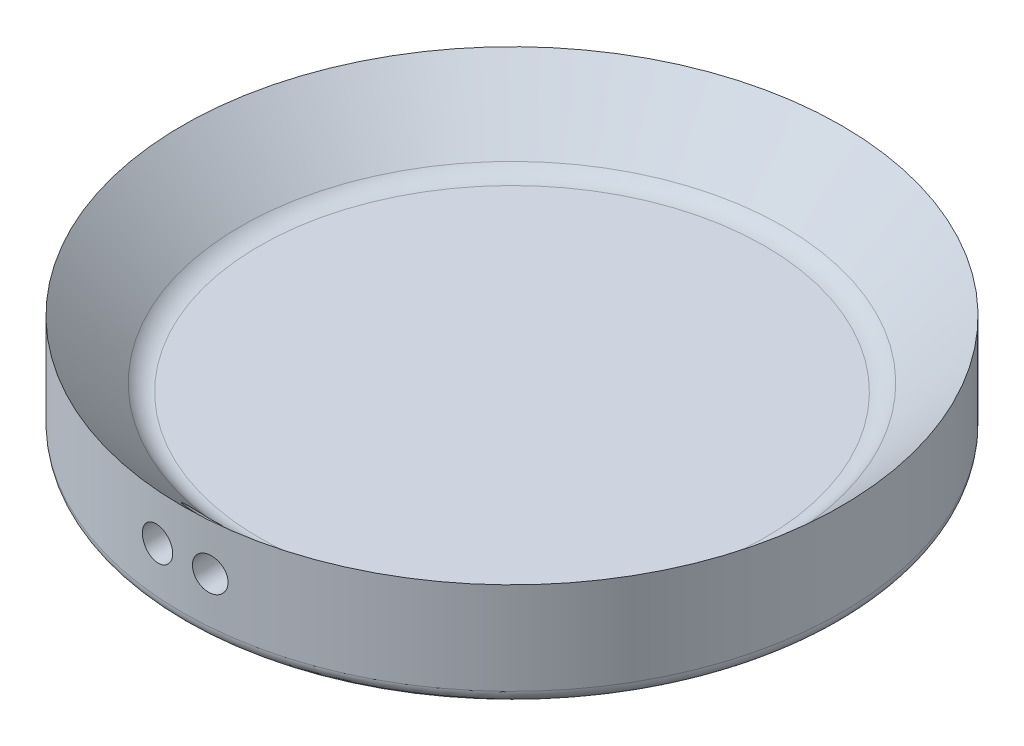
ISO-10303-21;
HEADER;
FILE_DESCRIPTION(('STEP AP214'),'2;1');
FILE_NAME('part.step','',(''),(''),'','','');
FILE_SCHEMA(('AUTOMOTIVE_DESIGN { 1 0 10303 214 1 1 1 1 }'));
ENDSEC;
DATA;
#1=APPLICATION_CONTEXT('core data for automotive mechanical design processes');
#2=APPLICATION_PROTOCOL_DEFINITION('international standard','automotive_design',2000,#1);
#3=PRODUCT_CONTEXT('',#1,'mechanical');
#4=PRODUCT('Part','Part','',(#3));
#5=PRODUCT_RELATED_PRODUCT_CATEGORY('part','',(#4));
#6=PRODUCT_DEFINITION_FORMATION('','',#4);
#7=PRODUCT_DEFINITION_CONTEXT('part definition',#1,'design');
#8=PRODUCT_DEFINITION('design','',#6,#7);
#9=PRODUCT_DEFINITION_SHAPE('','',#8);
#10=(LENGTH_UNIT() NAMED_UNIT(*) SI_UNIT(.MILLI.,.METRE.));
#11=(NAMED_UNIT(*) PLANE_ANGLE_UNIT() SI_UNIT($,.RADIAN.));
#12=(NAMED_UNIT(*) SI_UNIT($,.STERADIAN.) SOLID_ANGLE_UNIT());
#13=UNCERTAINTY_MEASURE_WITH_UNIT(LENGTH_MEASURE(1.E-05),#10,'distance_accuracy_value','');
#14=(GEOMETRIC_REPRESENTATION_CONTEXT(3) GLOBAL_UNCERTAINTY_ASSIGNED_CONTEXT((#13)) GLOBAL_UNIT_ASSIGNED_CONTEXT((#10,
#11,#12)) REPRESENTATION_CONTEXT('',''));
#15=CARTESIAN_POINT('',(0.,0.,0.));
#16=DIRECTION('',(0.,0.,1.));
#17=DIRECTION('',(1.,0.,0.));
#18=AXIS2_PLACEMENT_3D('',#15,#16,#17);
#19=CARTESIAN_POINT('',(0.,1.,0.));
#20=DIRECTION('',(0.,-1.,0.));
#21=DIRECTION('',(0.,0.,-1.));
#22=AXIS2_PLACEMENT_3D('',#19,#20,#21);
#23=TOROIDAL_SURFACE('',#22,24.,1.);
#24=CARTESIAN_POINT('',(0.,0.,0.));
#25=DIRECTION('',(0.,-1.,0.));
#26=DIRECTION('',(0.,0.,-1.));
#27=AXIS2_PLACEMENT_3D('',#24,#25,#26);
#28=CIRCLE('',#27,24.);
#29=CARTESIAN_POINT('',(0.,0.,-24.));
#30=VERTEX_POINT('',#29);
#31=EDGE_CURVE('E11',#30,#30,#28,.T.);
#32=ORIENTED_EDGE('',*,*,#31,.F.);
#33=EDGE_LOOP('',(#32));
#34=FACE_BOUND('',#33,.T.);
#35=CARTESIAN_POINT('',(0.,1.,0.));
#36=DIRECTION('',(0.,-1.,0.));
#37=DIRECTION('',(0.,0.,-1.));
#38=AXIS2_PLACEMENT_3D('',#35,#36,#37);
#39=CIRCLE('',#38,25.);
#40=CARTESIAN_POINT('',(0.,1.,-25.));
#41=VERTEX_POINT('',#40);
#42=EDGE_CURVE('E94',#41,#41,#39,.T.);
#43=ORIENTED_EDGE('',*,*,#42,.T.);
#44=EDGE_LOOP('',(#43));
#45=FACE_BOUND('',#44,.T.);
#46=ADVANCED_FACE('F43',(#34,#45),#23,.T.);
#47=CARTESIAN_POINT('',(-23.,0.,0.));
#48=DIRECTION('',(0.,1.,0.));
#49=DIRECTION('',(0.,0.,1.));
#50=AXIS2_PLACEMENT_3D('',#47,#48,#49);
#51=PLANE('',#50);
#52=ORIENTED_EDGE('',*,*,#31,.T.);
#53=EDGE_LOOP('',(#52));
#54=FACE_BOUND('',#53,.T.);
#55=ADVANCED_FACE('F103',(#54),#51,.F.);
#56=CARTESIAN_POINT('',(-19.1715728752538,3.,0.));
#57=DIRECTION('',(0.,-1.,0.));
#58=DIRECTION('',(0.,0.,-1.));
#59=AXIS2_PLACEMENT_3D('',#56,#57,#58);
#60=PLANE('',#59);
#61=CARTESIAN_POINT('',(0.,3.,0.));
#62=DIRECTION('',(0.,-1.,0.));
#63=DIRECTION('',(0.,0.,-1.));
#64=AXIS2_PLACEMENT_3D('',#61,#62,#63);
#65=CIRCLE('',#64,19.1715728752538);
#66=CARTESIAN_POINT('',(0.,3.,-19.1715728752538));
#67=VERTEX_POINT('',#66);
#68=EDGE_CURVE('E51',#67,#67,#65,.T.);
#69=ORIENTED_EDGE('',*,*,#68,.F.);
#70=EDGE_LOOP('',(#69));
#71=FACE_BOUND('',#70,.T.);
#72=ADVANCED_FACE('F101',(#71),#60,.F.);
#73=CARTESIAN_POINT('',(0.,5.,0.));
#74=DIRECTION('',(0.,-1.,0.));
#75=DIRECTION('',(0.,0.,-1.));
#76=AXIS2_PLACEMENT_3D('',#73,#74,#75);
#77=TOROIDAL_SURFACE('',#76,19.1715728752538,2.);
#78=CARTESIAN_POINT('',(0.,3.58578643762691,0.));
#79=DIRECTION('',(0.,-1.,0.));
#80=DIRECTION('',(0.,0.,-1.));
#81=AXIS2_PLACEMENT_3D('',#78,#79,#80);
#82=CIRCLE('',#81,20.5857864376269);
#83=CARTESIAN_POINT('',(-2.85247496289947,3.58578643762691,20.3872016187022));
#84=VERTEX_POINT('',#83);
#85=CARTESIAN_POINT('',(2.85247496290102,3.58578643762691,20.387201618702));
#86=VERTEX_POINT('',#85);
#87=EDGE_CURVE('E81',#84,#86,#82,.T.);
#88=ORIENTED_EDGE('',*,*,#87,.F.);
#89=CARTESIAN_POINT('',(-1.14731060297547,3.58598643762691,20.5539902409752));
#90=CARTESIAN_POINT('',(-1.17836910274067,3.55704887583815,20.5233002651125));
#91=CARTESIAN_POINT('',(-1.21072049622054,3.52978943464466,20.4923269365122));
#92=CARTESIAN_POINT('',(-1.27823050260366,3.47854515874682,20.4303706299804));
#93=CARTESIAN_POINT('',(-1.31340002269319,3.45457412757363,20.399388127535));
#94=CARTESIAN_POINT('',(-1.38738082620898,3.40953484455078,20.3375084882057));
#95=CARTESIAN_POINT('',(-1.42625858491709,3.38854868910006,20.3066307140796));
#96=CARTESIAN_POINT('',(-1.50719460972939,3.35037238512577,20.246882850705));
#97=CARTESIAN_POINT('',(-1.54924622112553,3.33317457488465,20.2180087916435));
#98=CARTESIAN_POINT('',(-1.62879723355809,3.30579483562055,20.1690467497428));
#99=CARTESIAN_POINT('',(-1.66565621647578,3.2949012891322,20.148329357683));
#100=CARTESIAN_POINT('',(-1.74195035187021,3.27629858470714,20.1107951046286));
#101=CARTESIAN_POINT('',(-1.78137496595754,3.26857724837749,20.0939634371921));
#102=CARTESIAN_POINT('',(-1.86353875337165,3.25676842474513,20.0657242793244));
#103=CARTESIAN_POINT('',(-1.90632413326257,3.25274745231417,20.0544177260255));
#104=CARTESIAN_POINT('',(-1.99337767286545,3.24926528883855,20.0396495404596));
#105=CARTESIAN_POINT('',(-2.03764167082773,3.24979222352777,20.0361675088928));
#106=CARTESIAN_POINT('',(-2.11895663651221,3.25510869281678,20.0373092524846));
#107=CARTESIAN_POINT('',(-2.15607662233652,3.25923483472825,20.040776132966));
#108=CARTESIAN_POINT('',(-2.22903574268484,3.27060555876532,20.0527484277325));
#109=CARTESIAN_POINT('',(-2.26487187541271,3.27785699063872,20.0612649248375));
#110=CARTESIAN_POINT('',(-2.35327113186256,3.29969217509644,20.0876390476753));
#111=CARTESIAN_POINT('',(-2.40459356635819,3.31612444729053,20.1080557409066));
#112=CARTESIAN_POINT('',(-2.50286223180715,3.35438545238826,20.1539790727209));
#113=CARTESIAN_POINT('',(-2.54978692974308,3.37623900340674,20.1795090127343));
#114=CARTESIAN_POINT('',(-2.64249732734089,3.42638315899958,20.2349540457116));
#115=CARTESIAN_POINT('',(-2.68799348911771,3.45500815916098,20.2650486711558));
#116=CARTESIAN_POINT('',(-2.7525700136402,3.50158616915557,20.3107960472831));
#117=CARTESIAN_POINT('',(-2.77336723130564,3.51760935137244,20.3260503577064));
#118=CARTESIAN_POINT('',(-2.81385383970137,3.55088106404315,20.3566659143429));
#119=CARTESIAN_POINT('',(-2.83354372117485,3.56812904390616,20.3720271097411));
#120=CARTESIAN_POINT('',(-2.85268939702452,3.58598643762691,20.38737353486));
#121=B_SPLINE_CURVE_WITH_KNOTS('',3,(#89,#90,#91,#92,#93,#94,#95,#96,#97,#98,#99,#100,#101,#102,
#103,#104,#105,#106,#107,#108,#109,#110,#111,#112,#113,#114,#115,#116,#117,#118,#119,#120),
.UNSPECIFIED.,.F.,.F.,(4,2,2,2,2,2,2,2,2,2,2,2,2,2,2,4),(0.,0.157112347147616,0.314865234865165,
0.47635046846814,0.637506045901573,0.768222261299038,0.898431847600866,1.03093870199825,
1.16309969517204,1.2750735204241,1.38729401856144,1.55919989300859,1.7319077486367,
1.91624689642003,2.00730213230426,2.09831669157474),.UNSPECIFIED.);
#122=CARTESIAN_POINT('',(-1.14752503709898,3.58578643762691,20.5537779871442));
#123=VERTEX_POINT('',#122);
#124=EDGE_CURVE('E57',#123,#84,#121,.T.);
#125=ORIENTED_EDGE('',*,*,#124,.F.);
#126=CARTESIAN_POINT('',(1.14752503709895,3.58578643762691,20.5537779871442));
#127=VERTEX_POINT('',#126);
#128=EDGE_CURVE('E82',#127,#123,#82,.T.);
#129=ORIENTED_EDGE('',*,*,#128,.F.);
#130=CARTESIAN_POINT('',(2.85268939702452,3.58598643762691,20.38737353486));
#131=CARTESIAN_POINT('',(2.82793788338175,3.56290729569633,20.3675488851106));
#132=CARTESIAN_POINT('',(2.80227708853949,3.54083645057499,20.3476757623004));
#133=CARTESIAN_POINT('',(2.7490684570584,3.49872303141239,20.3081591606468));
#134=CARTESIAN_POINT('',(2.72151704685445,3.47868448626019,20.2885162037005));
#135=CARTESIAN_POINT('',(2.66407919022513,3.44042066801062,20.2495437449214));
#136=CARTESIAN_POINT('',(2.63416143071912,3.42223126824484,20.2302249572389));
#137=CARTESIAN_POINT('',(2.57234772431025,3.38817158499622,20.1928075644665));
#138=CARTESIAN_POINT('',(2.54045363456027,3.37229916994852,20.174707846229));
#139=CARTESIAN_POINT('',(2.46913918805816,3.34061585874972,20.1376348921153));
#140=CARTESIAN_POINT('',(2.42934129344454,3.32524005997925,20.1190033871505));
#141=CARTESIAN_POINT('',(2.34688724576522,3.29831946235259,20.0861160136245));
#142=CARTESIAN_POINT('',(2.30424506123472,3.28675739094122,20.0718404395156));
#143=CARTESIAN_POINT('',(2.22496073651337,3.2698801280248,20.0519868385668));
#144=CARTESIAN_POINT('',(2.18878588725487,3.26378389562427,20.0452510162971));
#145=CARTESIAN_POINT('',(2.11545983030712,3.25479825190552,20.0371545938131));
#146=CARTESIAN_POINT('',(2.07831020587123,3.25190393451257,20.035785761916));
#147=CARTESIAN_POINT('',(2.00406562333002,3.24945358795167,20.0389057476227));
#148=CARTESIAN_POINT('',(1.9669709586508,3.24990481442299,20.0434072791403));
#149=CARTESIAN_POINT('',(1.8940073230984,3.2539635831287,20.0577648996872));
#150=CARTESIAN_POINT('',(1.85814018447476,3.25757564662417,20.0676286511774));
#151=CARTESIAN_POINT('',(1.77285856864332,3.26975717406879,20.0968214639598));
#152=CARTESIAN_POINT('',(1.72444844471418,3.27981069224059,20.118406551907));
#153=CARTESIAN_POINT('',(1.63141938514708,3.30459538197734,20.1669633523542));
#154=CARTESIAN_POINT('',(1.58683118772792,3.31936065028358,20.193973780392));
#155=CARTESIAN_POINT('',(1.50550956778401,3.35122381311432,20.2480990061991));
#156=CARTESIAN_POINT('',(1.46843615578844,3.36794278085042,20.2749353326396));
#157=CARTESIAN_POINT('',(1.39681650333275,3.40442428855136,20.3299510450804));
#158=CARTESIAN_POINT('',(1.36227312656915,3.42419020109454,20.3581318951347));
#159=CARTESIAN_POINT('',(1.2964059974727,3.46610383233523,20.4143179797422));
#160=CARTESIAN_POINT('',(1.26502201161035,3.48817656187469,20.4423088432001));
#161=CARTESIAN_POINT('',(1.20451055892665,3.5350408229509,20.4982703102501));
#162=CARTESIAN_POINT('',(1.17537808686817,3.55982600949046,20.5262408133282));
#163=CARTESIAN_POINT('',(1.14731060297549,3.58598643762689,20.5539902409752));
#164=B_SPLINE_CURVE_WITH_KNOTS('',3,(#130,#131,#132,#133,#134,#135,#136,#137,#138,#139,#140,
#141,#142,#143,#144,#145,#146,#147,#148,#149,#150,#151,#152,#153,#154,#155,#156,#157,#158,#159,
#160,#161,#162,#163),.UNSPECIFIED.,.F.,.F.,(4,2,2,2,2,2,2,2,2,2,2,2,2,2,2,2,4),(0.,
0.117647521780671,0.235523890653321,0.355368943901768,0.475103038452052,0.614430377203868,
0.753117742629565,0.864555761569081,0.975822794160213,1.08733120730279,1.19899938327398,
1.359933298589,1.52205928465179,1.66803372947934,1.81417092516685,1.9565213994308,
2.09854573012608),.UNSPECIFIED.);
#165=EDGE_CURVE('E64',#86,#127,#164,.T.);
#166=ORIENTED_EDGE('',*,*,#165,.F.);
#167=EDGE_LOOP('',(#88,#125,#129,#166));
#168=FACE_BOUND('',#167,.T.);
#169=ORIENTED_EDGE('',*,*,#68,.T.);
#170=EDGE_LOOP('',(#169));
#171=FACE_BOUND('',#170,.T.);
#172=ADVANCED_FACE('F79',(#168,#171),#77,.F.);
#173=CARTESIAN_POINT('',(0.,3.58578643762691,0.));
#174=DIRECTION('',(0.,1.,0.));
#175=DIRECTION('',(0.,0.,1.));
#176=AXIS2_PLACEMENT_3D('',#173,#174,#175);
#177=CONICAL_SURFACE('',#176,20.5857864376269,0.785398163397449);
#178=CARTESIAN_POINT('',(0.,8.,0.));
#179=DIRECTION('',(0.,-1.,0.));
#180=DIRECTION('',(0.,0.,-1.));
#181=AXIS2_PLACEMENT_3D('',#178,#179,#180);
#182=CIRCLE('',#181,25.);
#183=CARTESIAN_POINT('',(0.,8.,-25.));
#184=VERTEX_POINT('',#183);
#185=EDGE_CURVE('E89',#184,#184,#182,.T.);
#186=ORIENTED_EDGE('',*,*,#185,.F.);
#187=EDGE_LOOP('',(#186));
#188=FACE_BOUND('',#187,.T.);
#189=ORIENTED_EDGE('',*,*,#128,.T.);
#190=CARTESIAN_POINT('',(-2.53264658719639,3.36916508138984,20.2111005978713));
#191=CARTESIAN_POINT('',(-2.59504280155045,3.39854523208588,20.2328845064906));
#192=CARTESIAN_POINT('',(-2.65325982336948,3.43227089265067,20.259325786473));
#193=CARTESIAN_POINT('',(-2.76053366173475,3.50588798106984,20.3192854610815));
#194=CARTESIAN_POINT('',(-2.80968373046507,3.54570791275273,20.3527232605342));
#195=CARTESIAN_POINT('',(-2.91053575192211,3.64015713244906,20.4339738904194));
#196=CARTESIAN_POINT('',(-2.95983977605491,3.69600827033496,20.483294369521));
#197=CARTESIAN_POINT('',(-3.04612519851252,3.81197809835145,20.5878794266517));
#198=CARTESIAN_POINT('',(-3.08304112011585,3.87211748846163,20.6431736082467));
#199=CARTESIAN_POINT('',(-3.15667798007386,4.01689708266199,20.7785058853198));
#200=CARTESIAN_POINT('',(-3.18843258593619,4.10248440013688,20.8602221308522));
#201=CARTESIAN_POINT('',(-3.23271168902773,4.27457065834688,21.0275290814645));
#202=CARTESIAN_POINT('',(-3.24523491409052,4.36106965900928,21.1131200424734));
#203=CARTESIAN_POINT('',(-3.252608782261,4.53509930499902,21.2880513931606));
#204=CARTESIAN_POINT('',(-3.24703406592413,4.62260590111165,21.3774325773142));
#205=CARTESIAN_POINT('',(-3.21786826204292,4.79483453095017,21.5559946281001));
#206=CARTESIAN_POINT('',(-3.19427359171542,4.87955600743555,21.6451754513591));
#207=CARTESIAN_POINT('',(-3.13114849575043,5.03829637407371,21.8147693724276));
#208=CARTESIAN_POINT('',(-3.09290065560938,5.11264561870532,21.8953486779014));
#209=CARTESIAN_POINT('',(-2.99969215865021,5.2552196288772,22.0522084714011));
#210=CARTESIAN_POINT('',(-2.94475692552195,5.32345350795849,22.1284952910391));
#211=CARTESIAN_POINT('',(-2.83731164331946,5.43013575913361,22.250012985524));
#212=CARTESIAN_POINT('',(-2.78969108574412,5.471111233004,22.2973481116245));
#213=CARTESIAN_POINT('',(-2.68558669099929,5.54719387549102,22.3867556405492));
#214=CARTESIAN_POINT('',(-2.62911604616181,5.5823096205345,22.4288357116633));
#215=CARTESIAN_POINT('',(-2.52145145387608,5.63725098830375,22.496441661076));
#216=CARTESIAN_POINT('',(-2.47209877822791,5.65873255344189,22.5235394522463));
#217=CARTESIAN_POINT('',(-2.36848968372346,5.69571240578089,22.5718525622072));
#218=CARTESIAN_POINT('',(-2.31423970338942,5.71121841167387,22.5930754596041));
#219=CARTESIAN_POINT('',(-2.21084946667086,5.73303308517257,22.6253239669462));
#220=CARTESIAN_POINT('',(-2.16227866418865,5.74041575362748,22.6374373383243));
#221=CARTESIAN_POINT('',(-2.06349286867935,5.7493688197304,22.6556455275034));
#222=CARTESIAN_POINT('',(-2.01327890851722,5.75094280042916,22.66174405382));
#223=CARTESIAN_POINT('',(-1.91252470189957,5.74795593884422,22.6674722698303));
#224=CARTESIAN_POINT('',(-1.8619839478464,5.7433792561176,22.6670852270851));
#225=CARTESIAN_POINT('',(-1.76228632432271,5.72822491376745,22.6598543429126));
#226=CARTESIAN_POINT('',(-1.71312977499318,5.717645877683,22.6530090202325));
#227=CARTESIAN_POINT('',(-1.61921733110426,5.69155364081375,22.6337535700307));
#228=CARTESIAN_POINT('',(-1.5743680685781,5.67622356418688,22.6215438996921));
#229=CARTESIAN_POINT('',(-1.48802364770841,5.64129465788935,22.5923833217594));
#230=CARTESIAN_POINT('',(-1.44652990682439,5.62169403701227,22.5754304238496));
#231=CARTESIAN_POINT('',(-1.34960551216842,5.56945016626176,22.5291307552935));
#232=CARTESIAN_POINT('',(-1.29623271852734,5.53489263003604,22.4976308881366));
#233=CARTESIAN_POINT('',(-1.19766649756841,5.46051722826253,22.4286128346845));
#234=CARTESIAN_POINT('',(-1.15249178534055,5.42068767687276,22.3910812378036));
#235=CARTESIAN_POINT('',(-1.05343795772864,5.32053892165029,22.2957344252163));
#236=CARTESIAN_POINT('',(-1.00338222670417,5.25842875223048,22.2358383950109));
#237=CARTESIAN_POINT('',(-0.917506669727972,5.12984249486531,22.1108504338932));
#238=CARTESIAN_POINT('',(-0.881710036119472,5.06335949747784,22.0457502432261));
#239=CARTESIAN_POINT('',(-0.813530652344026,4.90549441952093,21.8904121808679));
#240=CARTESIAN_POINT('',(-0.786166866089421,4.81313152087561,21.7989644161348));
#241=CARTESIAN_POINT('',(-0.752861238746401,4.62688818264702,21.6137837623476));
#242=CARTESIAN_POINT('',(-0.746938061528466,4.53300649232922,21.5200489538514));
#243=CARTESIAN_POINT('',(-0.756039914194165,4.34500076542075,21.331608700798));
#244=CARTESIAN_POINT('',(-0.771313165305364,4.25088696066917,21.2369048666034));
#245=CARTESIAN_POINT('',(-0.82378295681542,4.06615085555927,21.0500595320569));
#246=CARTESIAN_POINT('',(-0.860969597119791,3.97552699818696,20.9579168942731));
#247=CARTESIAN_POINT('',(-0.945545394017613,3.82474858726587,20.8033063185417));
#248=CARTESIAN_POINT('',(-0.987538158626707,3.76293196154736,20.7394978786687));
#249=CARTESIAN_POINT('',(-1.08467162977531,3.64533154373188,20.6168829240038));
#250=CARTESIAN_POINT('',(-1.13975528467022,3.58952305973486,20.558056166802));
#251=CARTESIAN_POINT('',(-1.24048283149772,3.50593380736506,20.4684188241243));
#252=CARTESIAN_POINT('',(-1.2819260582075,3.4754883012212,20.4353718773926));
#253=CARTESIAN_POINT('',(-1.3704341814986,3.41883673039134,20.3728479424287));
#254=CARTESIAN_POINT('',(-1.41752571582983,3.39265224534729,20.3433893051365));
#255=CARTESIAN_POINT('',(-1.46735341280361,3.36916508138984,20.3162437491492));
#256=B_SPLINE_CURVE_WITH_KNOTS('',3,(#190,#191,#192,#193,#194,#195,#196,#197,#198,#199,#200,
#201,#202,#203,#204,#205,#206,#207,#208,#209,#210,#211,#212,#213,#214,#215,#216,#217,#218,#219,
#220,#221,#222,#223,#224,#225,#226,#227,#228,#229,#230,#231,#232,#233,#234,#235,#236,#237,#238,
#239,#240,#241,#242,#243,#244,#245,#246,#247,#248,#249,#250,#251,#252,#253,#254,#255),
.UNSPECIFIED.,.F.,.F.,(4,2,2,2,2,2,2,2,2,2,2,2,2,2,2,2,2,2,2,2,2,2,2,2,2,2,2,2,2,2,2,2,4),(0.,
0.215942693338118,0.429522777526101,0.696147670723173,0.964160381973677,1.32977076665518,
1.69540533562323,2.06969513655091,2.44405937431767,2.79121987012946,3.13785408803109,
3.37314071120727,3.60807988444267,3.78822234754503,3.96813133250079,4.11928118156382,
4.2703377792398,4.42178415513254,4.57326527478458,4.71951217238427,4.8658205292248,
5.07750873582097,5.28967427963647,5.58730024602436,5.88540834189469,6.28182736365997,
6.6785913819881,7.08004112241416,7.48130963361176,7.77515508123866,8.06774266992936,
8.25066099216136,8.43447865247908),.UNSPECIFIED.);
#257=EDGE_CURVE('E87',#84,#123,#256,.T.);
#258=ORIENTED_EDGE('',*,*,#257,.F.);
#259=ORIENTED_EDGE('',*,*,#87,.T.);
#260=CARTESIAN_POINT('',(1.46735341280363,3.36916508138983,20.3162437491492));
#261=CARTESIAN_POINT('',(1.43218350778003,3.38573436704525,20.335396089845));
#262=CARTESIAN_POINT('',(1.39835781181706,3.40366751059836,20.3557211985992));
#263=CARTESIAN_POINT('',(1.33347515610451,3.44185984434091,20.3983484575289));
#264=CARTESIAN_POINT('',(1.30241312858213,3.46211461439445,20.4206468329406));
#265=CARTESIAN_POINT('',(1.21381472535644,3.52549648569927,20.4896672880273));
#266=CARTESIAN_POINT('',(1.16026082510855,3.57153911273398,20.5388557598831));
#267=CARTESIAN_POINT('',(1.04968099887256,3.68315546387434,20.6566077309357));
#268=CARTESIAN_POINT('',(0.996115118486196,3.75053057084092,20.7266654411569));
#269=CARTESIAN_POINT('',(0.905074383729058,3.89116364517654,20.8716058659768));
#270=CARTESIAN_POINT('',(0.867664563745703,3.96444400555675,20.9465067114437));
#271=CARTESIAN_POINT('',(0.807609565593835,4.11596233640067,21.1005390218453));
#272=CARTESIAN_POINT('',(0.785294528264885,4.19427250891658,21.1797265328956));
#273=CARTESIAN_POINT('',(0.756120398115797,4.35256147639654,21.3391765837757));
#274=CARTESIAN_POINT('',(0.749258437673588,4.43253995899226,21.4194389213691));
#275=CARTESIAN_POINT('',(0.751040605965058,4.60976755433481,21.596713255025));
#276=CARTESIAN_POINT('',(0.763295217081352,4.70707007824238,21.6936549436648));
#277=CARTESIAN_POINT('',(0.811340142494194,4.89923542815874,21.8842110360914));
#278=CARTESIAN_POINT('',(0.847110083789352,4.99410029222741,21.9778282461764));
#279=CARTESIAN_POINT('',(0.927152247681864,5.14496021914287,22.125561116777));
#280=CARTESIAN_POINT('',(0.963895736433402,5.20279660150227,22.1818997157466));
#281=CARTESIAN_POINT('',(1.04905322935952,5.31431520152026,22.289678620611));
#282=CARTESIAN_POINT('',(1.09744647678158,5.3680045857764,22.3411274139394));
#283=CARTESIAN_POINT('',(1.19307933661596,5.45628855436014,22.4246064153931));
#284=CARTESIAN_POINT('',(1.2375736004073,5.492298158978,22.458273202199));
#285=CARTESIAN_POINT('',(1.33378584937383,5.55928323327931,22.5198670054227));
#286=CARTESIAN_POINT('',(1.38549398494756,5.59026544450035,22.5478017218541));
#287=CARTESIAN_POINT('',(1.48475095530145,5.63993707186204,22.5912393486446));
#288=CARTESIAN_POINT('',(1.53108510299951,5.65984583676743,22.6081095178292));
#289=CARTESIAN_POINT('',(1.62741547715195,5.6942736878321,22.6358959629852));
#290=CARTESIAN_POINT('',(1.67740892190073,5.70879681809833,22.6468167093182));
#291=CARTESIAN_POINT('',(1.78011356382601,5.731637201151,22.6618864517073));
#292=CARTESIAN_POINT('',(1.83283850417066,5.73991897509118,22.6659968906886));
#293=CARTESIAN_POINT('',(1.93897665010599,5.7496455805803,22.6669259569606));
#294=CARTESIAN_POINT('',(1.99238972558408,5.75109168613183,22.6637459431786));
#295=CARTESIAN_POINT('',(2.09334848615315,5.74744187677408,22.6509682305764));
#296=CARTESIAN_POINT('',(2.14099409037917,5.74291535029285,22.6419653426772));
#297=CARTESIAN_POINT('',(2.23419452853496,5.72877101790431,22.6187459389616));
#298=CARTESIAN_POINT('',(2.27974856542889,5.71915128833901,22.6045274538838));
#299=CARTESIAN_POINT('',(2.38306567927982,5.69143355482033,22.5660339726648));
#300=CARTESIAN_POINT('',(2.43969043485962,5.67156259075784,22.5399829603342));
#301=CARTESIAN_POINT('',(2.5469198498355,5.62552256300162,22.4817855674066));
#302=CARTESIAN_POINT('',(2.59751264199607,5.59934138057127,22.4496274837278));
#303=CARTESIAN_POINT('',(2.71124722042366,5.53082942428069,22.3672197820941));
#304=CARTESIAN_POINT('',(2.77145402570401,5.48620416561808,22.314840964626));
#305=CARTESIAN_POINT('',(2.88031594480554,5.3904034166104,22.2044515314376));
#306=CARTESIAN_POINT('',(2.92894980684957,5.33921613731946,22.1464308262766));
#307=CARTESIAN_POINT('',(3.032529340882,5.21105484625021,22.0031765069038));
#308=CARTESIAN_POINT('',(3.08239067792869,5.13187673750797,21.9162403302001));
#309=CARTESIAN_POINT('',(3.16276830151746,4.96778738126923,21.7389811769729));
#310=CARTESIAN_POINT('',(3.19326289251072,4.8828698215312,21.6486545217751));
#311=CARTESIAN_POINT('',(3.23600655582874,4.7075991288454,21.4650727368776));
#312=CARTESIAN_POINT('',(3.24784390638767,4.61716790297285,21.3717966663688));
#313=CARTESIAN_POINT('',(3.25161993956567,4.43460553003076,21.1865417114516));
#314=CARTESIAN_POINT('',(3.24357254242685,4.34247561693944,21.0945619648957));
#315=CARTESIAN_POINT('',(3.20934809543905,4.17437439016089,20.929744772422));
#316=CARTESIAN_POINT('',(3.18648263979496,4.09831647840262,20.8563095981624));
#317=CARTESIAN_POINT('',(3.12461035123949,3.94834769045349,20.7140172359543));
#318=CARTESIAN_POINT('',(3.08561638424906,3.87443515305106,20.6451564496598));
#319=CARTESIAN_POINT('',(3.0031495815387,3.75165208750312,20.5332140678183));
#320=CARTESIAN_POINT('',(2.96397918203852,3.70155909418564,20.4883087280407));
#321=CARTESIAN_POINT('',(2.87580033184099,3.60574734994527,20.4041177207247));
#322=CARTESIAN_POINT('',(2.82683168805876,3.56001197089055,20.3648103821397));
#323=CARTESIAN_POINT('',(2.73717908229243,3.48949559975781,20.3058687343871));
#324=CARTESIAN_POINT('',(2.69934756510975,3.46288056082149,20.284091913265));
#325=CARTESIAN_POINT('',(2.61925392804006,3.41313962795044,20.2444351332579));
#326=CARTESIAN_POINT('',(2.57696879826659,3.39003352796777,20.2265770455099));
#327=CARTESIAN_POINT('',(2.53264658719637,3.36916508138983,20.2111005978713));
#328=B_SPLINE_CURVE_WITH_KNOTS('',3,(#260,#261,#262,#263,#264,#265,#266,#267,#268,#269,#270,
#271,#272,#273,#274,#275,#276,#277,#278,#279,#280,#281,#282,#283,#284,#285,#286,#287,#288,#289,
#290,#291,#292,#293,#294,#295,#296,#297,#298,#299,#300,#301,#302,#303,#304,#305,#306,#307,#308,
#309,#310,#311,#312,#313,#314,#315,#316,#317,#318,#319,#320,#321,#322,#323,#324,#325,#326,#327),
.UNSPECIFIED.,.F.,.F.,(4,2,2,2,2,2,2,2,2,2,2,2,2,2,2,2,2,2,2,2,2,2,2,2,2,2,2,2,2,2,2,2,2,4),(0.,
0.129878156421695,0.259513021817563,0.516548465655496,0.847779043995535,1.18033079960545,
1.5199390987249,1.85948437165616,2.27128581267832,2.68273095020046,2.94808251484899,
3.21296474842423,3.41152099319688,3.60980874129047,3.76870136518348,3.92747443283742,
4.08714337249005,4.2467825525564,4.39224932449188,4.53777107718135,4.73295072158974,
4.92850823673924,5.20129736956356,5.47458363375032,5.85572772135801,6.2372980350041,
6.62717639048839,7.01678189044544,7.34021078324091,7.66338216872576,7.89617337045428,
8.12803735228866,8.28098920040046,8.43477413335992),.UNSPECIFIED.);
#329=EDGE_CURVE('E69',#127,#86,#328,.T.);
#330=ORIENTED_EDGE('',*,*,#329,.F.);
#331=EDGE_LOOP('',(#189,#258,#259,#330));
#332=FACE_BOUND('',#331,.T.);
#333=ADVANCED_FACE('F86',(#188,#332),#177,.F.);
#334=CARTESIAN_POINT('',(0.,0.,0.));
#335=DIRECTION('',(0.,-1.,0.));
#336=DIRECTION('',(0.,0.,-1.));
#337=AXIS2_PLACEMENT_3D('',#334,#335,#336);
#338=CYLINDRICAL_SURFACE('',#337,25.);
#339=CARTESIAN_POINT('',(-0.749999999999999,4.5,24.9887474676103));
#340=CARTESIAN_POINT('',(-0.750003083844835,4.57017874749353,24.9887476396042));
#341=CARTESIAN_POINT('',(-0.755929812255967,4.64040720378751,24.9885716749312));
#342=CARTESIAN_POINT('',(-0.779489644464877,4.77892889624823,24.9878476358306));
#343=CARTESIAN_POINT('',(-0.797136523638428,4.84721975644031,24.9872991235088));
#344=CARTESIAN_POINT('',(-0.843632769366483,4.97984159210651,24.9857723863538));
#345=CARTESIAN_POINT('',(-0.872476969403749,5.04417437802549,24.9847943596741));
#346=CARTESIAN_POINT('',(-0.940538064563988,5.1670633188232,24.9823245935945));
#347=CARTESIAN_POINT('',(-0.979752419534408,5.22562088351695,24.9808329799698));
#348=CARTESIAN_POINT('',(-1.06743666252173,5.33531778240251,24.9772396095764));
#349=CARTESIAN_POINT('',(-1.11590650086442,5.38645715640519,24.9751378560822));
#350=CARTESIAN_POINT('',(-1.22071743205572,5.47987080498793,24.9702341877897));
#351=CARTESIAN_POINT('',(-1.27705880040897,5.52214476914784,24.967432248482));
#352=CARTESIAN_POINT('',(-1.3960056856557,5.59663840567438,24.9610638860125));
#353=CARTESIAN_POINT('',(-1.45861186666136,5.62885701061117,24.9574973817557));
#354=CARTESIAN_POINT('',(-1.58829447929857,5.68233586031718,24.9495798891078));
#355=CARTESIAN_POINT('',(-1.65537092236283,5.70359607705907,24.9452288987102));
#356=CARTESIAN_POINT('',(-1.79218600542796,5.73460134368613,24.9357730081483));
#357=CARTESIAN_POINT('',(-1.86192839130397,5.74432952649678,24.930667015935));
#358=CARTESIAN_POINT('',(-2.00200696705406,5.75196501007288,24.919809446647));
#359=CARTESIAN_POINT('',(-2.07234316756895,5.74987209856032,24.9140578579808));
#360=CARTESIAN_POINT('',(-2.21186745143122,5.73392023975321,24.9020594077701));
#361=CARTESIAN_POINT('',(-2.28105085811437,5.72002160161528,24.8958109400263));
#362=CARTESIAN_POINT('',(-2.41608176575102,5.6808128584758,24.8830695728429));
#363=CARTESIAN_POINT('',(-2.48192917661033,5.65550244546259,24.8765766668102));
#364=CARTESIAN_POINT('',(-2.60866014506161,5.59407862404546,24.863607293794));
#365=CARTESIAN_POINT('',(-2.66952597474948,5.55792860205904,24.8571309587662));
#366=CARTESIAN_POINT('',(-2.78432113101408,5.47586799373488,24.8445345238834));
#367=CARTESIAN_POINT('',(-2.83825041749132,5.429957350976,24.8384144260878));
#368=CARTESIAN_POINT('',(-2.93761614263749,5.32967271277642,24.8268588085968));
#369=CARTESIAN_POINT('',(-2.98305540893027,5.27530154623288,24.821423061174));
#370=CARTESIAN_POINT('',(-3.064143908209,5.1596113277541,24.8115436084051));
#371=CARTESIAN_POINT('',(-3.09979344765979,5.09829249339869,24.8070998720052));
#372=CARTESIAN_POINT('',(-3.16007580518695,4.97081513547377,24.7994928038992));
#373=CARTESIAN_POINT('',(-3.1847702949711,4.90468620847004,24.7963223142474));
#374=CARTESIAN_POINT('',(-3.22270109133699,4.76916950617806,24.7914212363711));
#375=CARTESIAN_POINT('',(-3.23593794454322,4.69978188652307,24.7896905794547));
#376=CARTESIAN_POINT('',(-3.25050100080612,4.56025970676238,24.7877852517912));
#377=CARTESIAN_POINT('',(-3.25191332840158,4.49013427929909,24.7875993299626));
#378=CARTESIAN_POINT('',(-3.24301133109249,4.35064592464247,24.7887655395669));
#379=CARTESIAN_POINT('',(-3.23269725185113,4.28128298150617,24.7901176387789));
#380=CARTESIAN_POINT('',(-3.20069227721658,4.14546713426815,24.7942700168558));
#381=CARTESIAN_POINT('',(-3.17903030844478,4.07900729445762,24.797066613336));
#382=CARTESIAN_POINT('',(-3.12498348897483,3.95067295344293,24.8039354939627));
#383=CARTESIAN_POINT('',(-3.09259840788333,3.88879855079497,24.8080078055186));
#384=CARTESIAN_POINT('',(-3.01787018853812,3.77108115509146,24.8172093074851));
#385=CARTESIAN_POINT('',(-2.97548267959487,3.7152667030678,24.8223431941016));
#386=CARTESIAN_POINT('',(-2.88203791976037,3.61152762427397,24.833365968402));
#387=CARTESIAN_POINT('',(-2.83098029840845,3.56360333481081,24.8392548883447));
#388=CARTESIAN_POINT('',(-2.72121683982459,3.47663027324406,24.8515199800261));
#389=CARTESIAN_POINT('',(-2.66245680221169,3.43765036024584,24.857899458131));
#390=CARTESIAN_POINT('',(-2.53923950327581,3.3701074110317,24.8707879923402));
#391=CARTESIAN_POINT('',(-2.474782091278,3.34154465041403,24.8772970518679));
#392=CARTESIAN_POINT('',(-2.34168695615868,3.29553800383396,24.8901785317114));
#393=CARTESIAN_POINT('',(-2.27303248197124,3.27814235545827,24.8965502458493));
#394=CARTESIAN_POINT('',(-2.13373639827402,3.25517179545871,24.9088750413251));
#395=CARTESIAN_POINT('',(-2.06309479223827,3.24959686317042,24.9148281233948));
#396=CARTESIAN_POINT('',(-1.92190967404818,3.25044810924212,24.9261162838838));
#397=CARTESIAN_POINT('',(-1.8513661379712,3.25686141674997,24.9314520185712));
#398=CARTESIAN_POINT('',(-1.71232093327503,3.28150680164372,24.941387628459));
#399=CARTESIAN_POINT('',(-1.64381922744362,3.29973866349925,24.945987517077));
#400=CARTESIAN_POINT('',(-1.51108116682578,3.34743182181838,24.9543792504435));
#401=CARTESIAN_POINT('',(-1.4468298336081,3.37685091304457,24.9581740496763));
#402=CARTESIAN_POINT('',(-1.32416399780772,3.44609974492732,24.9649828335637));
#403=CARTESIAN_POINT('',(-1.26574917968953,3.48592892236918,24.9679968604427));
#404=CARTESIAN_POINT('',(-1.15660035246649,3.57473638684854,24.9732908956258));
#405=CARTESIAN_POINT('',(-1.10584398265089,3.62368706781317,24.9755730636261));
#406=CARTESIAN_POINT('',(-1.01324674676511,3.72944307828249,24.9795012980857));
#407=CARTESIAN_POINT('',(-0.971407998528668,3.78625026834882,24.9811472135175));
#408=CARTESIAN_POINT('',(-0.897878324814793,3.90605740275439,24.9838982546621));
#409=CARTESIAN_POINT('',(-0.866182526130884,3.96905435413342,24.9850036402091));
#410=CARTESIAN_POINT('',(-0.813843573744336,4.09943014847612,24.9867635121351));
#411=CARTESIAN_POINT('',(-0.793187463980109,4.16680375039265,24.9874185273238));
#412=CARTESIAN_POINT('',(-0.768917767944283,4.27882730191419,24.9881741584476));
#413=CARTESIAN_POINT('',(-0.761832621292266,4.32275498576029,24.988389980574));
#414=CARTESIAN_POINT('',(-0.752372760160149,4.41111513166378,24.9886765806982));
#415=CARTESIAN_POINT('',(-0.749998046640497,4.45554759382409,24.9887473586665));
#416=CARTESIAN_POINT('',(-0.749999999999999,4.5,24.9887474676103));
#417=B_SPLINE_CURVE_WITH_KNOTS('',3,(#339,#340,#341,#342,#343,#344,#345,#346,#347,#348,#349,
#350,#351,#352,#353,#354,#355,#356,#357,#358,#359,#360,#361,#362,#363,#364,#365,#366,#367,#368,
#369,#370,#371,#372,#373,#374,#375,#376,#377,#378,#379,#380,#381,#382,#383,#384,#385,#386,#387,
#388,#389,#390,#391,#392,#393,#394,#395,#396,#397,#398,#399,#400,#401,#402,#403,#404,#405,#406,
#407,#408,#409,#410,#411,#412,#413,#414,#415,#416),.UNSPECIFIED.,.T.,.F.,(4,2,2,2,2,2,2,2,2,2,2,
2,2,2,2,2,2,2,2,2,2,2,2,2,2,2,2,2,2,2,2,2,2,2,2,2,2,2,4),(0.,0.210374148571102,
0.420996000758879,0.631520785931672,0.841994051090025,1.0524661866695,1.26294569064951,
1.47344753055409,1.68394990883842,1.89475979537546,2.10557346755569,2.31709871323462,
2.52862966846739,2.74088333082687,2.95313822014961,3.16532229091189,3.37749971855007,
3.58846704194793,3.79942429989604,4.00884369095864,4.21825869485591,4.42714246321022,
4.63603071986496,4.84586362499495,5.05570549822165,5.26711236914931,5.47852483269328,
5.69084447788171,5.90316375190271,6.1152552059439,6.32734279226477,6.53863806424296,
6.74992190692316,6.96057639325263,7.17128085202228,7.38188392476627,7.59223929020472,
7.72549380853708,7.85874835403972),.UNSPECIFIED.);
#418=CARTESIAN_POINT('',(-0.749999999999999,4.5,24.9887474676103));
#419=VERTEX_POINT('',#418);
#420=EDGE_CURVE('E150',#419,#419,#417,.T.);
#421=ORIENTED_EDGE('',*,*,#420,.F.);
#422=EDGE_LOOP('',(#421));
#423=FACE_BOUND('',#422,.T.);
#424=CARTESIAN_POINT('',(3.25,4.5,24.7878498462452));
#425=CARTESIAN_POINT('',(3.24999685137975,4.56981825284214,24.787850524526));
#426=CARTESIAN_POINT('',(3.24413010060081,4.63968625560689,24.7886216544494));
#427=CARTESIAN_POINT('',(3.2208175333513,4.7774865879504,24.7916612423707));
#428=CARTESIAN_POINT('',(3.20335803967432,4.8454165321404,24.7939314689967));
#429=CARTESIAN_POINT('',(3.15738564775508,4.97731626008923,24.7998276116299));
#430=CARTESIAN_POINT('',(3.12888042653499,5.04128875862699,24.8034525859956));
#431=CARTESIAN_POINT('',(3.06165547833301,5.16351514625669,24.8118400687244));
#432=CARTESIAN_POINT('',(3.02293795204778,5.22177026370684,24.816602331987));
#433=CARTESIAN_POINT('',(2.93619221085708,5.33122977039882,24.8270152607103));
#434=CARTESIAN_POINT('',(2.88812177887416,5.38240031803714,24.8326699315917));
#435=CARTESIAN_POINT('',(2.78414481166699,5.47596575199692,24.8445420647471));
#436=CARTESIAN_POINT('',(2.72823768991245,5.51835998087357,24.8507595691335));
#437=CARTESIAN_POINT('',(2.60973372090107,5.59347162706531,24.8634844793566));
#438=CARTESIAN_POINT('',(2.54709266762528,5.62611902522641,24.8699936138753));
#439=CARTESIAN_POINT('',(2.41720793007722,5.68042045140909,24.882953229265));
#440=CARTESIAN_POINT('',(2.34996416712939,5.70207429146106,24.8894037091314));
#441=CARTESIAN_POINT('',(2.21258510853567,5.73381124446047,24.9019925770085));
#442=CARTESIAN_POINT('',(2.14244279631233,5.74386434231754,24.908130116339));
#443=CARTESIAN_POINT('',(2.00142185043968,5.7519928177423,24.9198578601933));
#444=CARTESIAN_POINT('',(1.93054322655638,5.75006835397146,24.9254480719662));
#445=CARTESIAN_POINT('',(1.79024092359632,5.73429042380044,24.9359173859548));
#446=CARTESIAN_POINT('',(1.72081423007755,5.72046486027525,24.9407981203218));
#447=CARTESIAN_POINT('',(1.58523810890157,5.68129213071607,24.9497823326299));
#448=CARTESIAN_POINT('',(1.51908861763365,5.65594518841003,24.9538858256618));
#449=CARTESIAN_POINT('',(1.39221668242738,5.59455340532975,24.9612852295326));
#450=CARTESIAN_POINT('',(1.33147468456258,5.55854933131372,24.9645841320133));
#451=CARTESIAN_POINT('',(1.21688409526827,5.47682232219592,24.9704323146831));
#452=CARTESIAN_POINT('',(1.1630354148477,5.43109951258097,24.9729816045501));
#453=CARTESIAN_POINT('',(1.06389246823657,5.33134631430618,24.9774016991671));
#454=CARTESIAN_POINT('',(1.01857921578129,5.27733486088977,24.9792740185211));
#455=CARTESIAN_POINT('',(0.937653485544975,5.16246207926262,24.9824428617399));
#456=CARTESIAN_POINT('',(0.902040977964733,5.10160077209441,24.9837393873736));
#457=CARTESIAN_POINT('',(0.841549626711591,4.97478978987935,24.9858502827325));
#458=CARTESIAN_POINT('',(0.816665341708599,4.90884271437953,24.9866648969604));
#459=CARTESIAN_POINT('',(0.778313091772681,4.77370491368743,24.9878890660681));
#460=CARTESIAN_POINT('',(0.764845131879773,4.70451418706318,24.9882986207692));
#461=CARTESIAN_POINT('',(0.749708044982567,4.56484447610769,24.9887574017174));
#462=CARTESIAN_POINT('',(0.748040311422407,4.49436534061831,24.9888065854098));
#463=CARTESIAN_POINT('',(0.756554817343428,4.35412713936768,24.9885502225079));
#464=CARTESIAN_POINT('',(0.766737063942101,4.28436807403896,24.9882446757005));
#465=CARTESIAN_POINT('',(0.798662721560071,4.14754584482123,24.9872445516319));
#466=CARTESIAN_POINT('',(0.820406857056544,4.08048285015342,24.9865499499921));
#467=CARTESIAN_POINT('',(0.874837113301608,3.95096170805215,24.9847032651054));
#468=CARTESIAN_POINT('',(0.90752321742983,3.88850355362432,24.9835511825533));
#469=CARTESIAN_POINT('',(0.982900581149231,3.7699718471011,24.9806990155928));
#470=CARTESIAN_POINT('',(1.02559077113924,3.7138976134113,24.9789989897612));
#471=CARTESIAN_POINT('',(1.11975796659845,3.60971678196518,24.9749545954939));
#472=CARTESIAN_POINT('',(1.17123494422203,3.56161015896016,24.9726102291003));
#473=CARTESIAN_POINT('',(1.28150015394746,3.47472710941426,24.9671944415108));
#474=CARTESIAN_POINT('',(1.34028802920947,3.43595022776608,24.9641230557937));
#475=CARTESIAN_POINT('',(1.46349528819906,3.36881273530824,24.9572030394818));
#476=CARTESIAN_POINT('',(1.52791467035713,3.34045212159559,24.9533544091035));
#477=CARTESIAN_POINT('',(1.6606071234012,3.29491193922991,24.9448753066656));
#478=CARTESIAN_POINT('',(1.72888361424542,3.2777424679633,24.9402441332741));
#479=CARTESIAN_POINT('',(1.86729670899092,3.25508715513349,24.9302630536687));
#480=CARTESIAN_POINT('',(1.93743334398037,3.24960150896421,24.9249131354366));
#481=CARTESIAN_POINT('',(2.07778510044734,3.25044480386397,24.9136063137028));
#482=CARTESIAN_POINT('',(2.14799988571393,3.25680709778136,24.9076477414327));
#483=CARTESIAN_POINT('',(2.28633381506828,3.28121113210227,24.8953309308357));
#484=CARTESIAN_POINT('',(2.35445290086136,3.29925319708716,24.8889726814062));
#485=CARTESIAN_POINT('',(2.48694052913782,3.34658938111916,24.8760844344599));
#486=CARTESIAN_POINT('',(2.5512938384081,3.37592599095723,24.8695538761857));
#487=CARTESIAN_POINT('',(2.67415435518719,3.44501991957723,24.8566433560395));
#488=CARTESIAN_POINT('',(2.73266169176473,3.48477700822318,24.8502633908452));
#489=CARTESIAN_POINT('',(2.84224000320552,3.57365541428193,24.8379693318862));
#490=CARTESIAN_POINT('',(2.89330238563449,3.62278740295608,24.8320557799781));
#491=CARTESIAN_POINT('',(2.98645496760006,3.72902805254654,24.821025226848));
#492=CARTESIAN_POINT('',(3.02854314493898,3.78613850649748,24.8159084052267));
#493=CARTESIAN_POINT('',(3.10236446703873,3.9064851897827,24.8067877310934));
#494=CARTESIAN_POINT('',(3.13413487634861,3.96969828003818,24.8027798812657));
#495=CARTESIAN_POINT('',(3.18655954673084,4.10058272101649,24.7960993604884));
#496=CARTESIAN_POINT('',(3.20722758249704,4.1682484297744,24.7934250353343));
#497=CARTESIAN_POINT('',(3.23133387571754,4.28029445199006,24.7902916997276));
#498=CARTESIAN_POINT('',(3.23832437343122,4.32392997109017,24.7893783247104));
#499=CARTESIAN_POINT('',(3.24765841844045,4.41170369497393,24.7881571851456));
#500=CARTESIAN_POINT('',(3.25000199141474,4.45584189697842,24.7878494172515));
#501=CARTESIAN_POINT('',(3.25,4.5,24.7878498462452));
#502=B_SPLINE_CURVE_WITH_KNOTS('',3,(#424,#425,#426,#427,#428,#429,#430,#431,#432,#433,#434,
#435,#436,#437,#438,#439,#440,#441,#442,#443,#444,#445,#446,#447,#448,#449,#450,#451,#452,#453,
#454,#455,#456,#457,#458,#459,#460,#461,#462,#463,#464,#465,#466,#467,#468,#469,#470,#471,#472,
#473,#474,#475,#476,#477,#478,#479,#480,#481,#482,#483,#484,#485,#486,#487,#488,#489,#490,#491,
#492,#493,#494,#495,#496,#497,#498,#499,#500,#501),.UNSPECIFIED.,.T.,.F.,(4,2,2,2,2,2,2,2,2,2,2,
2,2,2,2,2,2,2,2,2,2,2,2,2,2,2,2,2,2,2,2,2,2,2,2,2,2,2,4),(0.,0.209292843225496,
0.418833051541896,0.628227885291618,0.837577632397651,1.04789523237933,1.2582285818141,
1.47003844540325,1.68185193042929,1.89421222926531,2.10656971506416,2.31843066730721,
2.53028750570293,2.74134417632439,2.95239812198023,3.16297690573852,3.37355504262349,
3.58402624874488,3.7944975477839,4.0049937001686,4.21548997898435,4.42599944921935,
4.63650859970116,4.84699525355583,5.05748124038329,5.26795695756486,5.47843261608703,
5.68909791770574,5.89976674234835,6.11102951236887,6.3222981536431,6.53436949245059,
6.74643614806325,6.95874565068544,7.17110294351528,7.3826845108604,7.59400295946811,
7.72637559309668,7.85874749523705),.UNSPECIFIED.);
#503=CARTESIAN_POINT('',(3.25,4.5,24.7878498462452));
#504=VERTEX_POINT('',#503);
#505=EDGE_CURVE('E84',#504,#504,#502,.T.);
#506=ORIENTED_EDGE('',*,*,#505,.F.);
#507=EDGE_LOOP('',(#506));
#508=FACE_BOUND('',#507,.T.);
#509=ORIENTED_EDGE('',*,*,#42,.F.);
#510=EDGE_LOOP('',(#509));
#511=FACE_BOUND('',#510,.T.);
#512=ORIENTED_EDGE('',*,*,#185,.T.);
#513=EDGE_LOOP('',(#512));
#514=FACE_BOUND('',#513,.T.);
#515=ADVANCED_FACE('F176',(#423,#508,#511,#514),#338,.T.);
#516=CARTESIAN_POINT('',(2.,4.5,-25.001));
#517=DIRECTION('',(0.,0.,1.));
#518=DIRECTION('',(1.,0.,0.));
#519=AXIS2_PLACEMENT_3D('',#516,#517,#518);
#520=CYLINDRICAL_SURFACE('',#519,1.25);
#521=ORIENTED_EDGE('',*,*,#505,.T.);
#522=EDGE_LOOP('',(#521));
#523=FACE_BOUND('',#522,.T.);
#524=ORIENTED_EDGE('',*,*,#165,.T.);
#525=ORIENTED_EDGE('',*,*,#329,.T.);
#526=EDGE_LOOP('',(#524,#525));
#527=FACE_BOUND('',#526,.T.);
#528=ADVANCED_FACE('F70',(#523,#527),#520,.F.);
#529=CARTESIAN_POINT('',(-2.,4.5,-25.001));
#530=DIRECTION('',(0.,0.,1.));
#531=DIRECTION('',(1.,0.,0.));
#532=AXIS2_PLACEMENT_3D('',#529,#530,#531);
#533=CYLINDRICAL_SURFACE('',#532,1.25);
#534=ORIENTED_EDGE('',*,*,#420,.T.);
#535=EDGE_LOOP('',(#534));
#536=FACE_BOUND('',#535,.T.);
#537=ORIENTED_EDGE('',*,*,#124,.T.);
#538=ORIENTED_EDGE('',*,*,#257,.T.);
#539=EDGE_LOOP('',(#537,#538));
#540=FACE_BOUND('',#539,.T.);
#541=ADVANCED_FACE('F156',(#536,#540),#533,.F.);
#542=CLOSED_SHELL('',(#46,#55,#72,#172,#333,#515,#528,#541));
#543=MANIFOLD_SOLID_BREP('B2',#542);
#544=ADVANCED_BREP_SHAPE_REPRESENTATION('',(#18,#543),#14);
#545=SHAPE_DEFINITION_REPRESENTATION(#9,#544);
ENDSEC;
END-ISO-10303-21;
